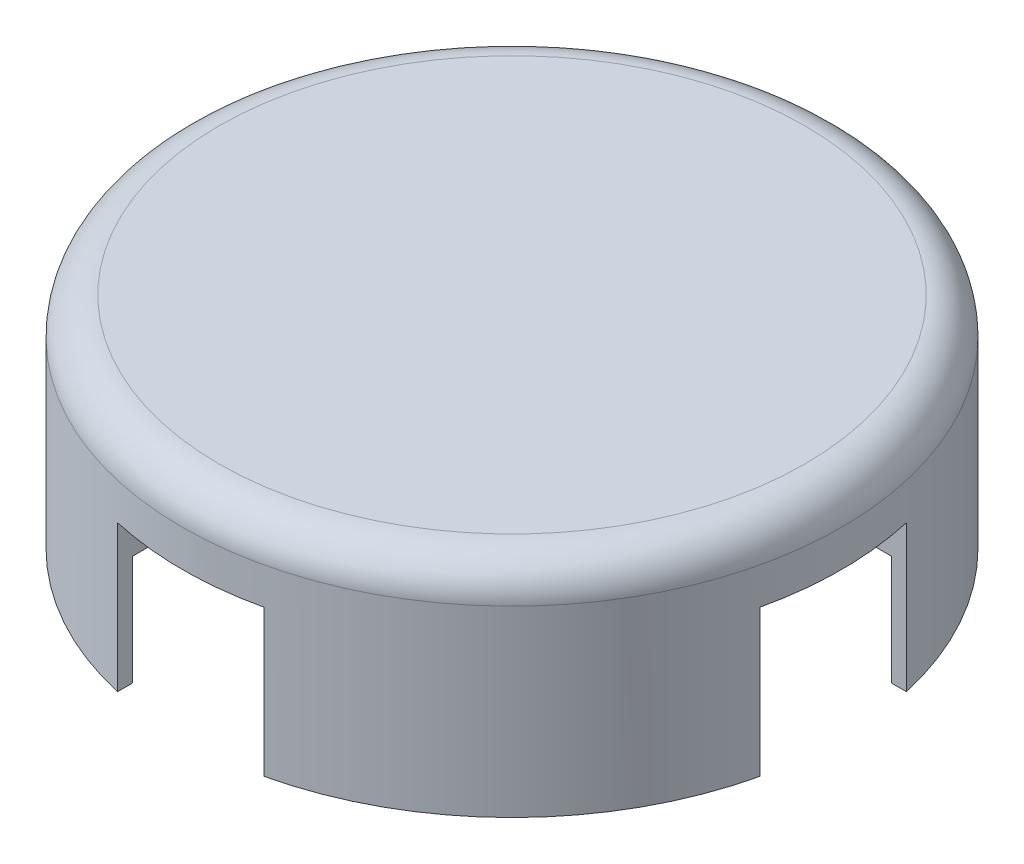
ISO-10303-21;
HEADER;
FILE_DESCRIPTION(('STEP AP214'),'2;1');
FILE_NAME('part.step','',(''),(''),'','','');
FILE_SCHEMA(('AUTOMOTIVE_DESIGN { 1 0 10303 214 1 1 1 1 }'));
ENDSEC;
DATA;
#1=APPLICATION_CONTEXT('core data for automotive mechanical design processes');
#2=APPLICATION_PROTOCOL_DEFINITION('international standard','automotive_design',2000,#1);
#3=PRODUCT_CONTEXT('',#1,'mechanical');
#4=PRODUCT('Part','Part','',(#3));
#5=PRODUCT_RELATED_PRODUCT_CATEGORY('part','',(#4));
#6=PRODUCT_DEFINITION_FORMATION('','',#4);
#7=PRODUCT_DEFINITION_CONTEXT('part definition',#1,'design');
#8=PRODUCT_DEFINITION('design','',#6,#7);
#9=PRODUCT_DEFINITION_SHAPE('','',#8);
#10=(LENGTH_UNIT() NAMED_UNIT(*) SI_UNIT(.MILLI.,.METRE.));
#11=(NAMED_UNIT(*) PLANE_ANGLE_UNIT() SI_UNIT($,.RADIAN.));
#12=(NAMED_UNIT(*) SI_UNIT($,.STERADIAN.) SOLID_ANGLE_UNIT());
#13=UNCERTAINTY_MEASURE_WITH_UNIT(LENGTH_MEASURE(1.E-05),#10,'distance_accuracy_value','');
#14=(GEOMETRIC_REPRESENTATION_CONTEXT(3) GLOBAL_UNCERTAINTY_ASSIGNED_CONTEXT((#13)) GLOBAL_UNIT_ASSIGNED_CONTEXT((#10,
#11,#12)) REPRESENTATION_CONTEXT('',''));
#15=CARTESIAN_POINT('',(0.,0.,0.));
#16=DIRECTION('',(0.,0.,1.));
#17=DIRECTION('',(1.,0.,0.));
#18=AXIS2_PLACEMENT_3D('',#15,#16,#17);
#19=CARTESIAN_POINT('',(0.,0.,0.));
#20=DIRECTION('',(0.,1.,0.));
#21=DIRECTION('',(0.,0.,1.));
#22=AXIS2_PLACEMENT_3D('',#19,#20,#21);
#23=PLANE('',#22);
#24=CARTESIAN_POINT('',(0.,0.,0.));
#25=DIRECTION('',(0.,1.,0.));
#26=DIRECTION('',(0.,0.,1.));
#27=AXIS2_PLACEMENT_3D('',#24,#25,#26);
#28=CIRCLE('',#27,45.);
#29=CARTESIAN_POINT('',(-43.8748219369606,0.,9.99999999999999));
#30=VERTEX_POINT('',#29);
#31=CARTESIAN_POINT('',(-10.,0.,43.8748219369606));
#32=VERTEX_POINT('',#31);
#33=EDGE_CURVE('E351',#30,#32,#28,.T.);
#34=ORIENTED_EDGE('',*,*,#33,.F.);
#35=DIRECTION('',(-1.,0.,0.));
#36=VECTOR('',#35,1.);
#37=CARTESIAN_POINT('',(-47.5,0.,9.99999999999999));
#38=LINE('',#37,#36);
#39=CARTESIAN_POINT('',(-41.821047332653,0.,9.99999999999999));
#40=VERTEX_POINT('',#39);
#41=EDGE_CURVE('E259',#40,#30,#38,.T.);
#42=ORIENTED_EDGE('',*,*,#41,.F.);
#43=CARTESIAN_POINT('',(0.,0.,0.));
#44=DIRECTION('',(0.,-1.,0.));
#45=DIRECTION('',(0.,0.,-1.));
#46=AXIS2_PLACEMENT_3D('',#43,#44,#45);
#47=CIRCLE('',#46,43.);
#48=CARTESIAN_POINT('',(-10.,0.,41.821047332653));
#49=VERTEX_POINT('',#48);
#50=EDGE_CURVE('E421',#49,#40,#47,.T.);
#51=ORIENTED_EDGE('',*,*,#50,.F.);
#52=DIRECTION('',(0.,0.,-1.));
#53=VECTOR('',#52,1.);
#54=CARTESIAN_POINT('',(-10.,0.,10.));
#55=LINE('',#54,#53);
#56=EDGE_CURVE('E289',#32,#49,#55,.T.);
#57=ORIENTED_EDGE('',*,*,#56,.F.);
#58=EDGE_LOOP('',(#34,#42,#51,#57));
#59=FACE_BOUND('',#58,.T.);
#60=ADVANCED_FACE('F38',(#59),#23,.F.);
#61=CARTESIAN_POINT('',(10.,0.,43.8748219369606));
#62=VERTEX_POINT('',#61);
#63=CARTESIAN_POINT('',(43.8748219369606,0.,10.));
#64=VERTEX_POINT('',#63);
#65=EDGE_CURVE('E358',#62,#64,#28,.T.);
#66=ORIENTED_EDGE('',*,*,#65,.F.);
#67=DIRECTION('',(0.,0.,1.));
#68=VECTOR('',#67,1.);
#69=CARTESIAN_POINT('',(10.,0.,47.5));
#70=LINE('',#69,#68);
#71=CARTESIAN_POINT('',(10.,0.,41.821047332653));
#72=VERTEX_POINT('',#71);
#73=EDGE_CURVE('E287',#72,#62,#70,.T.);
#74=ORIENTED_EDGE('',*,*,#73,.F.);
#75=CARTESIAN_POINT('',(41.821047332653,0.,10.));
#76=VERTEX_POINT('',#75);
#77=EDGE_CURVE('E357',#76,#72,#47,.T.);
#78=ORIENTED_EDGE('',*,*,#77,.F.);
#79=DIRECTION('',(-1.,0.,0.));
#80=VECTOR('',#79,1.);
#81=CARTESIAN_POINT('',(10.,0.,10.));
#82=LINE('',#81,#80);
#83=EDGE_CURVE('E285',#64,#76,#82,.T.);
#84=ORIENTED_EDGE('',*,*,#83,.F.);
#85=EDGE_LOOP('',(#66,#74,#78,#84));
#86=FACE_BOUND('',#85,.T.);
#87=ADVANCED_FACE('F453',(#86),#23,.F.);
#88=CARTESIAN_POINT('',(43.8748219369606,0.,-10.));
#89=VERTEX_POINT('',#88);
#90=CARTESIAN_POINT('',(10.,0.,-43.8748219369606));
#91=VERTEX_POINT('',#90);
#92=EDGE_CURVE('E362',#89,#91,#28,.T.);
#93=ORIENTED_EDGE('',*,*,#92,.F.);
#94=DIRECTION('',(1.,0.,0.));
#95=VECTOR('',#94,1.);
#96=CARTESIAN_POINT('',(47.5,0.,-10.));
#97=LINE('',#96,#95);
#98=CARTESIAN_POINT('',(41.821047332653,0.,-10.));
#99=VERTEX_POINT('',#98);
#100=EDGE_CURVE('E283',#99,#89,#97,.T.);
#101=ORIENTED_EDGE('',*,*,#100,.F.);
#102=CARTESIAN_POINT('',(10.,0.,-41.821047332653));
#103=VERTEX_POINT('',#102);
#104=EDGE_CURVE('E354',#103,#99,#47,.T.);
#105=ORIENTED_EDGE('',*,*,#104,.F.);
#106=DIRECTION('',(0.,0.,1.));
#107=VECTOR('',#106,1.);
#108=CARTESIAN_POINT('',(10.,0.,-10.));
#109=LINE('',#108,#107);
#110=EDGE_CURVE('E281',#91,#103,#109,.T.);
#111=ORIENTED_EDGE('',*,*,#110,.F.);
#112=EDGE_LOOP('',(#93,#101,#105,#111));
#113=FACE_BOUND('',#112,.T.);
#114=ADVANCED_FACE('F473',(#113),#23,.F.);
#115=CARTESIAN_POINT('',(0.,15.,0.));
#116=DIRECTION('',(0.,-1.,0.));
#117=DIRECTION('',(0.,0.,-1.));
#118=AXIS2_PLACEMENT_3D('',#115,#116,#117);
#119=CYLINDRICAL_SURFACE('',#118,43.);
#120=ORIENTED_EDGE('',*,*,#50,.T.);
#121=DIRECTION('',(0.,-1.,0.));
#122=VECTOR('',#121,1.);
#123=CARTESIAN_POINT('',(-41.821047332653,15.,9.99999999999999));
#124=LINE('',#123,#122);
#125=CARTESIAN_POINT('',(-41.821047332653,15.,9.99999999999999));
#126=VERTEX_POINT('',#125);
#127=EDGE_CURVE('E342',#40,#126,#124,.F.);
#128=ORIENTED_EDGE('',*,*,#127,.T.);
#129=CARTESIAN_POINT('',(0.,15.,0.));
#130=DIRECTION('',(0.,-1.,0.));
#131=DIRECTION('',(0.,0.,-1.));
#132=AXIS2_PLACEMENT_3D('',#129,#130,#131);
#133=CIRCLE('',#132,43.);
#134=CARTESIAN_POINT('',(-10.,15.,41.821047332653));
#135=VERTEX_POINT('',#134);
#136=EDGE_CURVE('E430',#135,#126,#133,.T.);
#137=ORIENTED_EDGE('',*,*,#136,.F.);
#138=DIRECTION('',(0.,-1.,0.));
#139=VECTOR('',#138,1.);
#140=CARTESIAN_POINT('',(-10.,15.,41.821047332653));
#141=LINE('',#140,#139);
#142=EDGE_CURVE('E336',#135,#49,#141,.T.);
#143=ORIENTED_EDGE('',*,*,#142,.T.);
#144=EDGE_LOOP('',(#120,#128,#137,#143));
#145=FACE_BOUND('',#144,.T.);
#146=ADVANCED_FACE('F428',(#145),#119,.F.);
#147=ORIENTED_EDGE('',*,*,#77,.T.);
#148=DIRECTION('',(0.,-1.,0.));
#149=VECTOR('',#148,1.);
#150=CARTESIAN_POINT('',(10.,15.,41.821047332653));
#151=LINE('',#150,#149);
#152=CARTESIAN_POINT('',(10.,15.,41.821047332653));
#153=VERTEX_POINT('',#152);
#154=EDGE_CURVE('E330',#72,#153,#151,.F.);
#155=ORIENTED_EDGE('',*,*,#154,.T.);
#156=CARTESIAN_POINT('',(41.821047332653,15.,10.));
#157=VERTEX_POINT('',#156);
#158=EDGE_CURVE('E352',#157,#153,#133,.T.);
#159=ORIENTED_EDGE('',*,*,#158,.F.);
#160=DIRECTION('',(0.,-1.,0.));
#161=VECTOR('',#160,1.);
#162=CARTESIAN_POINT('',(41.821047332653,15.,10.));
#163=LINE('',#162,#161);
#164=EDGE_CURVE('E324',#157,#76,#163,.T.);
#165=ORIENTED_EDGE('',*,*,#164,.T.);
#166=EDGE_LOOP('',(#147,#155,#159,#165));
#167=FACE_BOUND('',#166,.T.);
#168=ADVANCED_FACE('F447',(#167),#119,.F.);
#169=ORIENTED_EDGE('',*,*,#104,.T.);
#170=DIRECTION('',(0.,-1.,0.));
#171=VECTOR('',#170,1.);
#172=CARTESIAN_POINT('',(41.821047332653,15.,-10.));
#173=LINE('',#172,#171);
#174=CARTESIAN_POINT('',(41.821047332653,15.,-10.));
#175=VERTEX_POINT('',#174);
#176=EDGE_CURVE('E318',#99,#175,#173,.F.);
#177=ORIENTED_EDGE('',*,*,#176,.T.);
#178=CARTESIAN_POINT('',(10.,15.,-41.821047332653));
#179=VERTEX_POINT('',#178);
#180=EDGE_CURVE('E348',#179,#175,#133,.T.);
#181=ORIENTED_EDGE('',*,*,#180,.F.);
#182=DIRECTION('',(0.,-1.,0.));
#183=VECTOR('',#182,1.);
#184=CARTESIAN_POINT('',(10.,15.,-41.821047332653));
#185=LINE('',#184,#183);
#186=EDGE_CURVE('E312',#179,#103,#185,.T.);
#187=ORIENTED_EDGE('',*,*,#186,.T.);
#188=EDGE_LOOP('',(#169,#177,#181,#187));
#189=FACE_BOUND('',#188,.T.);
#190=ADVANCED_FACE('F482',(#189),#119,.F.);
#191=CARTESIAN_POINT('',(0.,15.,0.));
#192=DIRECTION('',(0.,-1.,0.));
#193=DIRECTION('',(0.,0.,-1.));
#194=AXIS2_PLACEMENT_3D('',#191,#192,#193);
#195=PLANE('',#194);
#196=CARTESIAN_POINT('',(-21.2132034355965,15.,21.2132034355964));
#197=DIRECTION('',(0.,-1.,0.));
#198=DIRECTION('',(0.,0.,-1.));
#199=AXIS2_PLACEMENT_3D('',#196,#197,#198);
#200=CIRCLE('',#199,2.49999999999999);
#201=CARTESIAN_POINT('',(-21.2132034355965,15.,18.7132034355964));
#202=VERTEX_POINT('',#201);
#203=EDGE_CURVE('E231',#202,#202,#200,.T.);
#204=ORIENTED_EDGE('',*,*,#203,.F.);
#205=EDGE_LOOP('',(#204));
#206=FACE_BOUND('',#205,.T.);
#207=DIRECTION('',(-1.,0.,0.));
#208=VECTOR('',#207,1.);
#209=CARTESIAN_POINT('',(0.,15.,10.));
#210=LINE('',#209,#208);
#211=CARTESIAN_POINT('',(-10.,15.,10.));
#212=VERTEX_POINT('',#211);
#213=EDGE_CURVE('E61',#212,#126,#210,.T.);
#214=ORIENTED_EDGE('',*,*,#213,.F.);
#215=DIRECTION('',(0.,0.,-1.));
#216=VECTOR('',#215,1.);
#217=CARTESIAN_POINT('',(-10.,15.,0.));
#218=LINE('',#217,#216);
#219=EDGE_CURVE('E374',#135,#212,#218,.T.);
#220=ORIENTED_EDGE('',*,*,#219,.F.);
#221=ORIENTED_EDGE('',*,*,#136,.T.);
#222=EDGE_LOOP('',(#214,#220,#221));
#223=FACE_BOUND('',#222,.T.);
#224=ADVANCED_FACE('F494',(#206,#223),#195,.T.);
#225=CARTESIAN_POINT('',(21.2132034355965,15.,21.2132034355964));
#226=DIRECTION('',(0.,-1.,0.));
#227=DIRECTION('',(0.,0.,-1.));
#228=AXIS2_PLACEMENT_3D('',#225,#226,#227);
#229=CIRCLE('',#228,2.49999999999999);
#230=CARTESIAN_POINT('',(21.2132034355965,15.,18.7132034355964));
#231=VERTEX_POINT('',#230);
#232=EDGE_CURVE('E243',#231,#231,#229,.T.);
#233=ORIENTED_EDGE('',*,*,#232,.F.);
#234=EDGE_LOOP('',(#233));
#235=FACE_BOUND('',#234,.T.);
#236=DIRECTION('',(0.,0.,1.));
#237=VECTOR('',#236,1.);
#238=CARTESIAN_POINT('',(10.,15.,0.));
#239=LINE('',#238,#237);
#240=CARTESIAN_POINT('',(10.,15.,10.));
#241=VERTEX_POINT('',#240);
#242=EDGE_CURVE('E372',#241,#153,#239,.T.);
#243=ORIENTED_EDGE('',*,*,#242,.F.);
#244=DIRECTION('',(-1.,0.,0.));
#245=VECTOR('',#244,1.);
#246=CARTESIAN_POINT('',(0.,15.,10.));
#247=LINE('',#246,#245);
#248=EDGE_CURVE('E370',#157,#241,#247,.T.);
#249=ORIENTED_EDGE('',*,*,#248,.F.);
#250=ORIENTED_EDGE('',*,*,#158,.T.);
#251=EDGE_LOOP('',(#243,#249,#250));
#252=FACE_BOUND('',#251,.T.);
#253=ADVANCED_FACE('F720',(#235,#252),#195,.T.);
#254=CARTESIAN_POINT('',(21.2132034355965,15.,-21.2132034355964));
#255=DIRECTION('',(0.,-1.,0.));
#256=DIRECTION('',(0.,0.,-1.));
#257=AXIS2_PLACEMENT_3D('',#254,#255,#256);
#258=CIRCLE('',#257,2.49999999999999);
#259=CARTESIAN_POINT('',(21.2132034355965,15.,-23.7132034355964));
#260=VERTEX_POINT('',#259);
#261=EDGE_CURVE('E237',#260,#260,#258,.T.);
#262=ORIENTED_EDGE('',*,*,#261,.F.);
#263=EDGE_LOOP('',(#262));
#264=FACE_BOUND('',#263,.T.);
#265=DIRECTION('',(1.,0.,0.));
#266=VECTOR('',#265,1.);
#267=CARTESIAN_POINT('',(0.,15.,-10.));
#268=LINE('',#267,#266);
#269=CARTESIAN_POINT('',(10.,15.,-10.));
#270=VERTEX_POINT('',#269);
#271=EDGE_CURVE('E368',#270,#175,#268,.T.);
#272=ORIENTED_EDGE('',*,*,#271,.F.);
#273=DIRECTION('',(0.,0.,1.));
#274=VECTOR('',#273,1.);
#275=CARTESIAN_POINT('',(10.,15.,0.));
#276=LINE('',#275,#274);
#277=EDGE_CURVE('E366',#179,#270,#276,.T.);
#278=ORIENTED_EDGE('',*,*,#277,.F.);
#279=ORIENTED_EDGE('',*,*,#180,.T.);
#280=EDGE_LOOP('',(#272,#278,#279));
#281=FACE_BOUND('',#280,.T.);
#282=ADVANCED_FACE('F495',(#264,#281),#195,.T.);
#283=CARTESIAN_POINT('',(0.,30.,0.));
#284=DIRECTION('',(0.,-1.,0.));
#285=DIRECTION('',(0.,0.,-1.));
#286=AXIS2_PLACEMENT_3D('',#283,#284,#285);
#287=CYLINDRICAL_SURFACE('',#286,45.);
#288=CARTESIAN_POINT('',(0.,25.,0.));
#289=DIRECTION('',(0.,1.,0.));
#290=DIRECTION('',(0.,0.,1.));
#291=AXIS2_PLACEMENT_3D('',#288,#289,#290);
#292=CIRCLE('',#291,45.);
#293=CARTESIAN_POINT('',(0.,25.,45.));
#294=VERTEX_POINT('',#293);
#295=EDGE_CURVE('E11',#294,#294,#292,.F.);
#296=ORIENTED_EDGE('',*,*,#295,.T.);
#297=EDGE_LOOP('',(#296));
#298=FACE_BOUND('',#297,.T.);
#299=ORIENTED_EDGE('',*,*,#65,.T.);
#300=DIRECTION('',(0.,-1.,0.));
#301=VECTOR('',#300,1.);
#302=CARTESIAN_POINT('',(43.8748219369606,30.,10.));
#303=LINE('',#302,#301);
#304=CARTESIAN_POINT('',(43.8748219369606,20.,10.));
#305=VERTEX_POINT('',#304);
#306=EDGE_CURVE('E327',#64,#305,#303,.F.);
#307=ORIENTED_EDGE('',*,*,#306,.T.);
#308=CARTESIAN_POINT('',(0.,20.,0.));
#309=DIRECTION('',(0.,1.,0.));
#310=DIRECTION('',(0.,0.,1.));
#311=AXIS2_PLACEMENT_3D('',#308,#309,#310);
#312=CIRCLE('',#311,45.);
#313=CARTESIAN_POINT('',(43.8748219369606,20.,-10.));
#314=VERTEX_POINT('',#313);
#315=EDGE_CURVE('E380',#305,#314,#312,.T.);
#316=ORIENTED_EDGE('',*,*,#315,.T.);
#317=DIRECTION('',(0.,-1.,0.));
#318=VECTOR('',#317,1.);
#319=CARTESIAN_POINT('',(43.8748219369606,30.,-10.));
#320=LINE('',#319,#318);
#321=EDGE_CURVE('E321',#314,#89,#320,.T.);
#322=ORIENTED_EDGE('',*,*,#321,.T.);
#323=ORIENTED_EDGE('',*,*,#92,.T.);
#324=DIRECTION('',(0.,-1.,0.));
#325=VECTOR('',#324,1.);
#326=CARTESIAN_POINT('',(10.,30.,-43.8748219369606));
#327=LINE('',#326,#325);
#328=CARTESIAN_POINT('',(10.,20.,-43.8748219369606));
#329=VERTEX_POINT('',#328);
#330=EDGE_CURVE('E315',#91,#329,#327,.F.);
#331=ORIENTED_EDGE('',*,*,#330,.T.);
#332=CARTESIAN_POINT('',(-10.,20.,-43.8748219369606));
#333=VERTEX_POINT('',#332);
#334=EDGE_CURVE('E385',#329,#333,#312,.T.);
#335=ORIENTED_EDGE('',*,*,#334,.T.);
#336=DIRECTION('',(0.,-1.,0.));
#337=VECTOR('',#336,1.);
#338=CARTESIAN_POINT('',(-10.,30.,-43.8748219369606));
#339=LINE('',#338,#337);
#340=CARTESIAN_POINT('',(-10.,0.,-43.8748219369606));
#341=VERTEX_POINT('',#340);
#342=EDGE_CURVE('E309',#333,#341,#339,.T.);
#343=ORIENTED_EDGE('',*,*,#342,.T.);
#344=CARTESIAN_POINT('',(-43.8748219369606,0.,-10.));
#345=VERTEX_POINT('',#344);
#346=EDGE_CURVE('E414',#341,#345,#28,.T.);
#347=ORIENTED_EDGE('',*,*,#346,.T.);
#348=DIRECTION('',(0.,-1.,0.));
#349=VECTOR('',#348,1.);
#350=CARTESIAN_POINT('',(-43.8748219369606,30.,-10.));
#351=LINE('',#350,#349);
#352=CARTESIAN_POINT('',(-43.8748219369606,20.,-10.));
#353=VERTEX_POINT('',#352);
#354=EDGE_CURVE('E303',#345,#353,#351,.F.);
#355=ORIENTED_EDGE('',*,*,#354,.T.);
#356=CARTESIAN_POINT('',(-43.8748219369606,20.,9.99999999999999));
#357=VERTEX_POINT('',#356);
#358=EDGE_CURVE('E379',#353,#357,#312,.T.);
#359=ORIENTED_EDGE('',*,*,#358,.T.);
#360=DIRECTION('',(0.,-1.,0.));
#361=VECTOR('',#360,1.);
#362=CARTESIAN_POINT('',(-43.8748219369606,30.,9.99999999999999));
#363=LINE('',#362,#361);
#364=EDGE_CURVE('E344',#357,#30,#363,.T.);
#365=ORIENTED_EDGE('',*,*,#364,.T.);
#366=ORIENTED_EDGE('',*,*,#33,.T.);
#367=DIRECTION('',(0.,-1.,0.));
#368=VECTOR('',#367,1.);
#369=CARTESIAN_POINT('',(-10.,30.,43.8748219369606));
#370=LINE('',#369,#368);
#371=CARTESIAN_POINT('',(-10.,20.,43.8748219369606));
#372=VERTEX_POINT('',#371);
#373=EDGE_CURVE('E339',#32,#372,#370,.F.);
#374=ORIENTED_EDGE('',*,*,#373,.T.);
#375=CARTESIAN_POINT('',(10.,20.,43.8748219369606));
#376=VERTEX_POINT('',#375);
#377=EDGE_CURVE('E377',#372,#376,#312,.T.);
#378=ORIENTED_EDGE('',*,*,#377,.T.);
#379=DIRECTION('',(0.,-1.,0.));
#380=VECTOR('',#379,1.);
#381=CARTESIAN_POINT('',(10.,30.,43.8748219369606));
#382=LINE('',#381,#380);
#383=EDGE_CURVE('E333',#376,#62,#382,.T.);
#384=ORIENTED_EDGE('',*,*,#383,.T.);
#385=EDGE_LOOP('',(#299,#307,#316,#322,#323,#331,#335,#343,#347,#355,#359,#365,#366,#374,#378,#384));
#386=FACE_BOUND('',#385,.T.);
#387=ADVANCED_FACE('F389',(#298,#386),#287,.T.);
#388=CARTESIAN_POINT('',(0.,30.,0.));
#389=DIRECTION('',(0.,1.,0.));
#390=DIRECTION('',(0.,0.,1.));
#391=AXIS2_PLACEMENT_3D('',#388,#389,#390);
#392=PLANE('',#391);
#393=CARTESIAN_POINT('',(0.,30.,0.));
#394=DIRECTION('',(0.,1.,0.));
#395=DIRECTION('',(0.,0.,1.));
#396=AXIS2_PLACEMENT_3D('',#393,#394,#395);
#397=CIRCLE('',#396,40.);
#398=CARTESIAN_POINT('',(0.,30.,40.));
#399=VERTEX_POINT('',#398);
#400=EDGE_CURVE('E46',#399,#399,#397,.T.);
#401=ORIENTED_EDGE('',*,*,#400,.T.);
#402=EDGE_LOOP('',(#401));
#403=FACE_BOUND('',#402,.T.);
#404=ADVANCED_FACE('F476',(#403),#392,.T.);
#405=ORIENTED_EDGE('',*,*,#346,.F.);
#406=DIRECTION('',(0.,0.,-1.));
#407=VECTOR('',#406,1.);
#408=CARTESIAN_POINT('',(-10.,0.,-47.5));
#409=LINE('',#408,#407);
#410=CARTESIAN_POINT('',(-10.,0.,-41.821047332653));
#411=VERTEX_POINT('',#410);
#412=EDGE_CURVE('E279',#411,#341,#409,.T.);
#413=ORIENTED_EDGE('',*,*,#412,.F.);
#414=CARTESIAN_POINT('',(-41.821047332653,0.,-10.));
#415=VERTEX_POINT('',#414);
#416=EDGE_CURVE('E347',#415,#411,#47,.T.);
#417=ORIENTED_EDGE('',*,*,#416,.F.);
#418=DIRECTION('',(1.,0.,0.));
#419=VECTOR('',#418,1.);
#420=CARTESIAN_POINT('',(-10.,0.,-10.));
#421=LINE('',#420,#419);
#422=EDGE_CURVE('E255',#345,#415,#421,.T.);
#423=ORIENTED_EDGE('',*,*,#422,.F.);
#424=EDGE_LOOP('',(#405,#413,#417,#423));
#425=FACE_BOUND('',#424,.T.);
#426=ADVANCED_FACE('F443',(#425),#23,.F.);
#427=ORIENTED_EDGE('',*,*,#416,.T.);
#428=DIRECTION('',(0.,-1.,0.));
#429=VECTOR('',#428,1.);
#430=CARTESIAN_POINT('',(-10.,15.,-41.821047332653));
#431=LINE('',#430,#429);
#432=CARTESIAN_POINT('',(-10.,15.,-41.821047332653));
#433=VERTEX_POINT('',#432);
#434=EDGE_CURVE('E306',#411,#433,#431,.F.);
#435=ORIENTED_EDGE('',*,*,#434,.T.);
#436=CARTESIAN_POINT('',(-41.821047332653,15.,-10.));
#437=VERTEX_POINT('',#436);
#438=EDGE_CURVE('E353',#437,#433,#133,.T.);
#439=ORIENTED_EDGE('',*,*,#438,.F.);
#440=DIRECTION('',(0.,-1.,0.));
#441=VECTOR('',#440,1.);
#442=CARTESIAN_POINT('',(-41.821047332653,15.,-10.));
#443=LINE('',#442,#441);
#444=EDGE_CURVE('E53',#437,#415,#443,.T.);
#445=ORIENTED_EDGE('',*,*,#444,.T.);
#446=EDGE_LOOP('',(#427,#435,#439,#445));
#447=FACE_BOUND('',#446,.T.);
#448=ADVANCED_FACE('F439',(#447),#119,.F.);
#449=CARTESIAN_POINT('',(-21.2132034355965,15.,-21.2132034355964));
#450=DIRECTION('',(0.,-1.,0.));
#451=DIRECTION('',(0.,0.,-1.));
#452=AXIS2_PLACEMENT_3D('',#449,#450,#451);
#453=CIRCLE('',#452,2.49999999999999);
#454=CARTESIAN_POINT('',(-21.2132034355965,15.,-23.7132034355964));
#455=VERTEX_POINT('',#454);
#456=EDGE_CURVE('E249',#455,#455,#453,.T.);
#457=ORIENTED_EDGE('',*,*,#456,.F.);
#458=EDGE_LOOP('',(#457));
#459=FACE_BOUND('',#458,.T.);
#460=DIRECTION('',(0.,0.,-1.));
#461=VECTOR('',#460,1.);
#462=CARTESIAN_POINT('',(-10.,15.,0.));
#463=LINE('',#462,#461);
#464=CARTESIAN_POINT('',(-10.,15.,-10.));
#465=VERTEX_POINT('',#464);
#466=EDGE_CURVE('E364',#465,#433,#463,.T.);
#467=ORIENTED_EDGE('',*,*,#466,.F.);
#468=DIRECTION('',(1.,0.,0.));
#469=VECTOR('',#468,1.);
#470=CARTESIAN_POINT('',(0.,15.,-10.));
#471=LINE('',#470,#469);
#472=EDGE_CURVE('E361',#437,#465,#471,.T.);
#473=ORIENTED_EDGE('',*,*,#472,.F.);
#474=ORIENTED_EDGE('',*,*,#438,.T.);
#475=EDGE_LOOP('',(#467,#473,#474));
#476=FACE_BOUND('',#475,.T.);
#477=ADVANCED_FACE('F436',(#459,#476),#195,.T.);
#478=CARTESIAN_POINT('',(0.,20.,0.));
#479=DIRECTION('',(0.,1.,0.));
#480=DIRECTION('',(0.,0.,1.));
#481=AXIS2_PLACEMENT_3D('',#478,#479,#480);
#482=PLANE('',#481);
#483=CARTESIAN_POINT('',(0.,20.,30.));
#484=DIRECTION('',(0.,-1.,0.));
#485=DIRECTION('',(0.,0.,-1.));
#486=AXIS2_PLACEMENT_3D('',#483,#484,#485);
#487=CIRCLE('',#486,1.65);
#488=CARTESIAN_POINT('',(0.,20.,28.35));
#489=VERTEX_POINT('',#488);
#490=EDGE_CURVE('E209',#489,#489,#487,.T.);
#491=ORIENTED_EDGE('',*,*,#490,.F.);
#492=EDGE_LOOP('',(#491));
#493=FACE_BOUND('',#492,.T.);
#494=CARTESIAN_POINT('',(0.,20.,-30.));
#495=DIRECTION('',(0.,-1.,0.));
#496=DIRECTION('',(0.,0.,-1.));
#497=AXIS2_PLACEMENT_3D('',#494,#495,#496);
#498=CIRCLE('',#497,1.65);
#499=CARTESIAN_POINT('',(0.,20.,-31.65));
#500=VERTEX_POINT('',#499);
#501=EDGE_CURVE('E208',#500,#500,#498,.T.);
#502=ORIENTED_EDGE('',*,*,#501,.F.);
#503=EDGE_LOOP('',(#502));
#504=FACE_BOUND('',#503,.T.);
#505=CARTESIAN_POINT('',(-30.,20.,0.));
#506=DIRECTION('',(0.,-1.,0.));
#507=DIRECTION('',(0.,0.,-1.));
#508=AXIS2_PLACEMENT_3D('',#505,#506,#507);
#509=CIRCLE('',#508,1.65);
#510=CARTESIAN_POINT('',(-30.,20.,-1.65));
#511=VERTEX_POINT('',#510);
#512=EDGE_CURVE('E219',#511,#511,#509,.T.);
#513=ORIENTED_EDGE('',*,*,#512,.F.);
#514=EDGE_LOOP('',(#513));
#515=FACE_BOUND('',#514,.T.);
#516=CARTESIAN_POINT('',(30.,20.,0.));
#517=DIRECTION('',(0.,-1.,0.));
#518=DIRECTION('',(0.,0.,-1.));
#519=AXIS2_PLACEMENT_3D('',#516,#517,#518);
#520=CIRCLE('',#519,1.65);
#521=CARTESIAN_POINT('',(30.,20.,-1.65));
#522=VERTEX_POINT('',#521);
#523=EDGE_CURVE('E225',#522,#522,#520,.T.);
#524=ORIENTED_EDGE('',*,*,#523,.F.);
#525=EDGE_LOOP('',(#524));
#526=FACE_BOUND('',#525,.T.);
#527=DIRECTION('',(-1.,0.,0.));
#528=VECTOR('',#527,1.);
#529=CARTESIAN_POINT('',(10.,20.,10.));
#530=LINE('',#529,#528);
#531=CARTESIAN_POINT('',(10.,20.,10.));
#532=VERTEX_POINT('',#531);
#533=EDGE_CURVE('E267',#305,#532,#530,.T.);
#534=ORIENTED_EDGE('',*,*,#533,.T.);
#535=DIRECTION('',(0.,0.,1.));
#536=VECTOR('',#535,1.);
#537=CARTESIAN_POINT('',(10.,20.,47.5));
#538=LINE('',#537,#536);
#539=EDGE_CURVE('E269',#532,#376,#538,.T.);
#540=ORIENTED_EDGE('',*,*,#539,.T.);
#541=ORIENTED_EDGE('',*,*,#377,.F.);
#542=DIRECTION('',(0.,0.,-1.));
#543=VECTOR('',#542,1.);
#544=CARTESIAN_POINT('',(-10.,20.,10.));
#545=LINE('',#544,#543);
#546=CARTESIAN_POINT('',(-10.,20.,10.));
#547=VERTEX_POINT('',#546);
#548=EDGE_CURVE('E272',#372,#547,#545,.T.);
#549=ORIENTED_EDGE('',*,*,#548,.T.);
#550=DIRECTION('',(-1.,0.,0.));
#551=VECTOR('',#550,1.);
#552=CARTESIAN_POINT('',(-47.5,20.,9.99999999999999));
#553=LINE('',#552,#551);
#554=EDGE_CURVE('E274',#547,#357,#553,.T.);
#555=ORIENTED_EDGE('',*,*,#554,.T.);
#556=ORIENTED_EDGE('',*,*,#358,.F.);
#557=DIRECTION('',(1.,0.,0.));
#558=VECTOR('',#557,1.);
#559=CARTESIAN_POINT('',(-10.,20.,-10.));
#560=LINE('',#559,#558);
#561=CARTESIAN_POINT('',(-10.,20.,-10.));
#562=VERTEX_POINT('',#561);
#563=EDGE_CURVE('E256',#353,#562,#560,.T.);
#564=ORIENTED_EDGE('',*,*,#563,.T.);
#565=DIRECTION('',(0.,0.,-1.));
#566=VECTOR('',#565,1.);
#567=CARTESIAN_POINT('',(-10.,20.,-47.5));
#568=LINE('',#567,#566);
#569=EDGE_CURVE('E258',#562,#333,#568,.T.);
#570=ORIENTED_EDGE('',*,*,#569,.T.);
#571=ORIENTED_EDGE('',*,*,#334,.F.);
#572=DIRECTION('',(0.,0.,1.));
#573=VECTOR('',#572,1.);
#574=CARTESIAN_POINT('',(10.,20.,-10.));
#575=LINE('',#574,#573);
#576=CARTESIAN_POINT('',(10.,20.,-10.));
#577=VERTEX_POINT('',#576);
#578=EDGE_CURVE('E262',#329,#577,#575,.T.);
#579=ORIENTED_EDGE('',*,*,#578,.T.);
#580=DIRECTION('',(1.,0.,0.));
#581=VECTOR('',#580,1.);
#582=CARTESIAN_POINT('',(47.5,20.,-10.));
#583=LINE('',#582,#581);
#584=EDGE_CURVE('E264',#577,#314,#583,.T.);
#585=ORIENTED_EDGE('',*,*,#584,.T.);
#586=ORIENTED_EDGE('',*,*,#315,.F.);
#587=EDGE_LOOP('',(#534,#540,#541,#549,#555,#556,#564,#570,#571,#579,#585,#586));
#588=FACE_BOUND('',#587,.T.);
#589=ADVANCED_FACE('F395',(#493,#504,#515,#526,#588),#482,.F.);
#590=CARTESIAN_POINT('',(-47.5,20.,9.99999999999999));
#591=DIRECTION('',(0.,0.,1.));
#592=DIRECTION('',(1.,0.,0.));
#593=AXIS2_PLACEMENT_3D('',#590,#591,#592);
#594=PLANE('',#593);
#595=ORIENTED_EDGE('',*,*,#554,.F.);
#596=DIRECTION('',(0.,-1.,0.));
#597=VECTOR('',#596,1.);
#598=CARTESIAN_POINT('',(-10.,20.,10.));
#599=LINE('',#598,#597);
#600=EDGE_CURVE('E292',#547,#212,#599,.T.);
#601=ORIENTED_EDGE('',*,*,#600,.T.);
#602=ORIENTED_EDGE('',*,*,#213,.T.);
#603=ORIENTED_EDGE('',*,*,#127,.F.);
#604=ORIENTED_EDGE('',*,*,#41,.T.);
#605=ORIENTED_EDGE('',*,*,#364,.F.);
#606=EDGE_LOOP('',(#595,#601,#602,#603,#604,#605));
#607=FACE_BOUND('',#606,.T.);
#608=ADVANCED_FACE('F458',(#607),#594,.F.);
#609=CARTESIAN_POINT('',(-10.,20.,10.));
#610=DIRECTION('',(-1.,0.,0.));
#611=DIRECTION('',(0.,0.,1.));
#612=AXIS2_PLACEMENT_3D('',#609,#610,#611);
#613=PLANE('',#612);
#614=ORIENTED_EDGE('',*,*,#56,.T.);
#615=ORIENTED_EDGE('',*,*,#142,.F.);
#616=ORIENTED_EDGE('',*,*,#219,.T.);
#617=ORIENTED_EDGE('',*,*,#600,.F.);
#618=ORIENTED_EDGE('',*,*,#548,.F.);
#619=ORIENTED_EDGE('',*,*,#373,.F.);
#620=EDGE_LOOP('',(#614,#615,#616,#617,#618,#619));
#621=FACE_BOUND('',#620,.T.);
#622=ADVANCED_FACE('F423',(#621),#613,.F.);
#623=CARTESIAN_POINT('',(10.,20.,47.5));
#624=DIRECTION('',(1.,0.,0.));
#625=DIRECTION('',(0.,0.,-1.));
#626=AXIS2_PLACEMENT_3D('',#623,#624,#625);
#627=PLANE('',#626);
#628=ORIENTED_EDGE('',*,*,#539,.F.);
#629=DIRECTION('',(0.,-1.,0.));
#630=VECTOR('',#629,1.);
#631=CARTESIAN_POINT('',(10.,20.,10.));
#632=LINE('',#631,#630);
#633=EDGE_CURVE('E294',#532,#241,#632,.T.);
#634=ORIENTED_EDGE('',*,*,#633,.T.);
#635=ORIENTED_EDGE('',*,*,#242,.T.);
#636=ORIENTED_EDGE('',*,*,#154,.F.);
#637=ORIENTED_EDGE('',*,*,#73,.T.);
#638=ORIENTED_EDGE('',*,*,#383,.F.);
#639=EDGE_LOOP('',(#628,#634,#635,#636,#637,#638));
#640=FACE_BOUND('',#639,.T.);
#641=ADVANCED_FACE('F456',(#640),#627,.F.);
#642=CARTESIAN_POINT('',(10.,20.,10.));
#643=DIRECTION('',(0.,0.,1.));
#644=DIRECTION('',(1.,0.,0.));
#645=AXIS2_PLACEMENT_3D('',#642,#643,#644);
#646=PLANE('',#645);
#647=ORIENTED_EDGE('',*,*,#83,.T.);
#648=ORIENTED_EDGE('',*,*,#164,.F.);
#649=ORIENTED_EDGE('',*,*,#248,.T.);
#650=ORIENTED_EDGE('',*,*,#633,.F.);
#651=ORIENTED_EDGE('',*,*,#533,.F.);
#652=ORIENTED_EDGE('',*,*,#306,.F.);
#653=EDGE_LOOP('',(#647,#648,#649,#650,#651,#652));
#654=FACE_BOUND('',#653,.T.);
#655=ADVANCED_FACE('F505',(#654),#646,.F.);
#656=CARTESIAN_POINT('',(47.5,20.,-10.));
#657=DIRECTION('',(0.,0.,-1.));
#658=DIRECTION('',(-1.,0.,0.));
#659=AXIS2_PLACEMENT_3D('',#656,#657,#658);
#660=PLANE('',#659);
#661=ORIENTED_EDGE('',*,*,#584,.F.);
#662=DIRECTION('',(0.,-1.,0.));
#663=VECTOR('',#662,1.);
#664=CARTESIAN_POINT('',(10.,20.,-10.));
#665=LINE('',#664,#663);
#666=EDGE_CURVE('E297',#577,#270,#665,.T.);
#667=ORIENTED_EDGE('',*,*,#666,.T.);
#668=ORIENTED_EDGE('',*,*,#271,.T.);
#669=ORIENTED_EDGE('',*,*,#176,.F.);
#670=ORIENTED_EDGE('',*,*,#100,.T.);
#671=ORIENTED_EDGE('',*,*,#321,.F.);
#672=EDGE_LOOP('',(#661,#667,#668,#669,#670,#671));
#673=FACE_BOUND('',#672,.T.);
#674=ADVANCED_FACE('F502',(#673),#660,.F.);
#675=CARTESIAN_POINT('',(10.,20.,-10.));
#676=DIRECTION('',(1.,0.,0.));
#677=DIRECTION('',(0.,0.,-1.));
#678=AXIS2_PLACEMENT_3D('',#675,#676,#677);
#679=PLANE('',#678);
#680=ORIENTED_EDGE('',*,*,#110,.T.);
#681=ORIENTED_EDGE('',*,*,#186,.F.);
#682=ORIENTED_EDGE('',*,*,#277,.T.);
#683=ORIENTED_EDGE('',*,*,#666,.F.);
#684=ORIENTED_EDGE('',*,*,#578,.F.);
#685=ORIENTED_EDGE('',*,*,#330,.F.);
#686=EDGE_LOOP('',(#680,#681,#682,#683,#684,#685));
#687=FACE_BOUND('',#686,.T.);
#688=ADVANCED_FACE('F407',(#687),#679,.F.);
#689=CARTESIAN_POINT('',(-10.,20.,-47.5));
#690=DIRECTION('',(-1.,0.,0.));
#691=DIRECTION('',(0.,0.,1.));
#692=AXIS2_PLACEMENT_3D('',#689,#690,#691);
#693=PLANE('',#692);
#694=ORIENTED_EDGE('',*,*,#569,.F.);
#695=DIRECTION('',(0.,-1.,0.));
#696=VECTOR('',#695,1.);
#697=CARTESIAN_POINT('',(-10.,20.,-10.));
#698=LINE('',#697,#696);
#699=EDGE_CURVE('E277',#562,#465,#698,.T.);
#700=ORIENTED_EDGE('',*,*,#699,.T.);
#701=ORIENTED_EDGE('',*,*,#466,.T.);
#702=ORIENTED_EDGE('',*,*,#434,.F.);
#703=ORIENTED_EDGE('',*,*,#412,.T.);
#704=ORIENTED_EDGE('',*,*,#342,.F.);
#705=EDGE_LOOP('',(#694,#700,#701,#702,#703,#704));
#706=FACE_BOUND('',#705,.T.);
#707=ADVANCED_FACE('F403',(#706),#693,.F.);
#708=CARTESIAN_POINT('',(-10.,20.,-10.));
#709=DIRECTION('',(0.,0.,-1.));
#710=DIRECTION('',(-1.,0.,0.));
#711=AXIS2_PLACEMENT_3D('',#708,#709,#710);
#712=PLANE('',#711);
#713=ORIENTED_EDGE('',*,*,#422,.T.);
#714=ORIENTED_EDGE('',*,*,#444,.F.);
#715=ORIENTED_EDGE('',*,*,#472,.T.);
#716=ORIENTED_EDGE('',*,*,#699,.F.);
#717=ORIENTED_EDGE('',*,*,#563,.F.);
#718=ORIENTED_EDGE('',*,*,#354,.F.);
#719=EDGE_LOOP('',(#713,#714,#715,#716,#717,#718));
#720=FACE_BOUND('',#719,.T.);
#721=ADVANCED_FACE('F398',(#720),#712,.F.);
#722=CARTESIAN_POINT('',(0.,25.,0.));
#723=DIRECTION('',(0.,1.,0.));
#724=DIRECTION('',(0.,0.,1.));
#725=AXIS2_PLACEMENT_3D('',#722,#723,#724);
#726=TOROIDAL_SURFACE('',#725,40.,5.);
#727=ORIENTED_EDGE('',*,*,#295,.F.);
#728=EDGE_LOOP('',(#727));
#729=FACE_BOUND('',#728,.T.);
#730=ORIENTED_EDGE('',*,*,#400,.F.);
#731=EDGE_LOOP('',(#730));
#732=FACE_BOUND('',#731,.T.);
#733=ADVANCED_FACE('F40',(#729,#732),#726,.T.);
#734=CARTESIAN_POINT('',(-21.2132034355965,28.,-21.2132034355964));
#735=DIRECTION('',(0.,-1.,0.));
#736=DIRECTION('',(0.,0.,-1.));
#737=AXIS2_PLACEMENT_3D('',#734,#735,#736);
#738=CONICAL_SURFACE('',#737,2.5,1.02974425867665);
#739=CARTESIAN_POINT('',(-21.2132034355965,29.5021515475689,-21.2132034355964));
#740=VERTEX_POINT('',#739);
#741=VERTEX_LOOP('',#740);
#742=FACE_BOUND('',#741,.T.);
#743=CARTESIAN_POINT('',(-21.2132034355965,28.,-21.2132034355964));
#744=DIRECTION('',(0.,-1.,0.));
#745=DIRECTION('',(0.,0.,-1.));
#746=AXIS2_PLACEMENT_3D('',#743,#744,#745);
#747=CIRCLE('',#746,2.5);
#748=CARTESIAN_POINT('',(-21.2132034355965,28.,-23.7132034355964));
#749=VERTEX_POINT('',#748);
#750=EDGE_CURVE('E252',#749,#749,#747,.T.);
#751=ORIENTED_EDGE('',*,*,#750,.T.);
#752=EDGE_LOOP('',(#751));
#753=FACE_BOUND('',#752,.T.);
#754=ADVANCED_FACE('F541',(#742,#753),#738,.F.);
#755=CARTESIAN_POINT('',(-21.2132034355965,15.,-21.2132034355964));
#756=DIRECTION('',(0.,-1.,0.));
#757=DIRECTION('',(0.,0.,-1.));
#758=AXIS2_PLACEMENT_3D('',#755,#756,#757);
#759=CYLINDRICAL_SURFACE('',#758,2.49999999999999);
#760=ORIENTED_EDGE('',*,*,#750,.F.);
#761=EDGE_LOOP('',(#760));
#762=FACE_BOUND('',#761,.T.);
#763=ORIENTED_EDGE('',*,*,#456,.T.);
#764=EDGE_LOOP('',(#763));
#765=FACE_BOUND('',#764,.T.);
#766=ADVANCED_FACE('F548',(#762,#765),#759,.F.);
#767=CARTESIAN_POINT('',(21.2132034355965,28.,21.2132034355964));
#768=DIRECTION('',(0.,-1.,0.));
#769=DIRECTION('',(0.,0.,-1.));
#770=AXIS2_PLACEMENT_3D('',#767,#768,#769);
#771=CONICAL_SURFACE('',#770,2.5,1.02974425867665);
#772=CARTESIAN_POINT('',(21.2132034355965,29.5021515475689,21.2132034355964));
#773=VERTEX_POINT('',#772);
#774=VERTEX_LOOP('',#773);
#775=FACE_BOUND('',#774,.T.);
#776=CARTESIAN_POINT('',(21.2132034355965,28.,21.2132034355964));
#777=DIRECTION('',(0.,-1.,0.));
#778=DIRECTION('',(0.,0.,-1.));
#779=AXIS2_PLACEMENT_3D('',#776,#777,#778);
#780=CIRCLE('',#779,2.5);
#781=CARTESIAN_POINT('',(21.2132034355965,28.,18.7132034355964));
#782=VERTEX_POINT('',#781);
#783=EDGE_CURVE('E246',#782,#782,#780,.T.);
#784=ORIENTED_EDGE('',*,*,#783,.T.);
#785=EDGE_LOOP('',(#784));
#786=FACE_BOUND('',#785,.T.);
#787=ADVANCED_FACE('F557',(#775,#786),#771,.F.);
#788=CARTESIAN_POINT('',(21.2132034355965,15.,21.2132034355964));
#789=DIRECTION('',(0.,-1.,0.));
#790=DIRECTION('',(0.,0.,-1.));
#791=AXIS2_PLACEMENT_3D('',#788,#789,#790);
#792=CYLINDRICAL_SURFACE('',#791,2.49999999999999);
#793=ORIENTED_EDGE('',*,*,#783,.F.);
#794=EDGE_LOOP('',(#793));
#795=FACE_BOUND('',#794,.T.);
#796=ORIENTED_EDGE('',*,*,#232,.T.);
#797=EDGE_LOOP('',(#796));
#798=FACE_BOUND('',#797,.T.);
#799=ADVANCED_FACE('F565',(#795,#798),#792,.F.);
#800=CARTESIAN_POINT('',(21.2132034355965,28.,-21.2132034355964));
#801=DIRECTION('',(0.,-1.,0.));
#802=DIRECTION('',(0.,0.,-1.));
#803=AXIS2_PLACEMENT_3D('',#800,#801,#802);
#804=CONICAL_SURFACE('',#803,2.5,1.02974425867665);
#805=CARTESIAN_POINT('',(21.2132034355965,29.5021515475689,-21.2132034355964));
#806=VERTEX_POINT('',#805);
#807=VERTEX_LOOP('',#806);
#808=FACE_BOUND('',#807,.T.);
#809=CARTESIAN_POINT('',(21.2132034355965,28.,-21.2132034355964));
#810=DIRECTION('',(0.,-1.,0.));
#811=DIRECTION('',(0.,0.,-1.));
#812=AXIS2_PLACEMENT_3D('',#809,#810,#811);
#813=CIRCLE('',#812,2.5);
#814=CARTESIAN_POINT('',(21.2132034355965,28.,-23.7132034355964));
#815=VERTEX_POINT('',#814);
#816=EDGE_CURVE('E240',#815,#815,#813,.T.);
#817=ORIENTED_EDGE('',*,*,#816,.T.);
#818=EDGE_LOOP('',(#817));
#819=FACE_BOUND('',#818,.T.);
#820=ADVANCED_FACE('F573',(#808,#819),#804,.F.);
#821=CARTESIAN_POINT('',(21.2132034355965,15.,-21.2132034355964));
#822=DIRECTION('',(0.,-1.,0.));
#823=DIRECTION('',(0.,0.,-1.));
#824=AXIS2_PLACEMENT_3D('',#821,#822,#823);
#825=CYLINDRICAL_SURFACE('',#824,2.49999999999999);
#826=ORIENTED_EDGE('',*,*,#816,.F.);
#827=EDGE_LOOP('',(#826));
#828=FACE_BOUND('',#827,.T.);
#829=ORIENTED_EDGE('',*,*,#261,.T.);
#830=EDGE_LOOP('',(#829));
#831=FACE_BOUND('',#830,.T.);
#832=ADVANCED_FACE('F581',(#828,#831),#825,.F.);
#833=CARTESIAN_POINT('',(-21.2132034355965,28.,21.2132034355964));
#834=DIRECTION('',(0.,-1.,0.));
#835=DIRECTION('',(0.,0.,-1.));
#836=AXIS2_PLACEMENT_3D('',#833,#834,#835);
#837=CONICAL_SURFACE('',#836,2.5,1.02974425867665);
#838=CARTESIAN_POINT('',(-21.2132034355965,29.5021515475689,21.2132034355964));
#839=VERTEX_POINT('',#838);
#840=VERTEX_LOOP('',#839);
#841=FACE_BOUND('',#840,.T.);
#842=CARTESIAN_POINT('',(-21.2132034355965,28.,21.2132034355964));
#843=DIRECTION('',(0.,-1.,0.));
#844=DIRECTION('',(0.,0.,-1.));
#845=AXIS2_PLACEMENT_3D('',#842,#843,#844);
#846=CIRCLE('',#845,2.5);
#847=CARTESIAN_POINT('',(-21.2132034355965,28.,18.7132034355964));
#848=VERTEX_POINT('',#847);
#849=EDGE_CURVE('E234',#848,#848,#846,.T.);
#850=ORIENTED_EDGE('',*,*,#849,.T.);
#851=EDGE_LOOP('',(#850));
#852=FACE_BOUND('',#851,.T.);
#853=ADVANCED_FACE('F589',(#841,#852),#837,.F.);
#854=CARTESIAN_POINT('',(-21.2132034355965,15.,21.2132034355964));
#855=DIRECTION('',(0.,-1.,0.));
#856=DIRECTION('',(0.,0.,-1.));
#857=AXIS2_PLACEMENT_3D('',#854,#855,#856);
#858=CYLINDRICAL_SURFACE('',#857,2.49999999999999);
#859=ORIENTED_EDGE('',*,*,#849,.F.);
#860=EDGE_LOOP('',(#859));
#861=FACE_BOUND('',#860,.T.);
#862=ORIENTED_EDGE('',*,*,#203,.T.);
#863=EDGE_LOOP('',(#862));
#864=FACE_BOUND('',#863,.T.);
#865=ADVANCED_FACE('F597',(#861,#864),#858,.F.);
#866=CARTESIAN_POINT('',(30.,28.,0.));
#867=DIRECTION('',(0.,-1.,0.));
#868=DIRECTION('',(0.,0.,-1.));
#869=AXIS2_PLACEMENT_3D('',#866,#867,#868);
#870=CONICAL_SURFACE('',#869,1.65,1.02974425867665);
#871=CARTESIAN_POINT('',(30.,28.9914200213955,0.));
#872=VERTEX_POINT('',#871);
#873=VERTEX_LOOP('',#872);
#874=FACE_BOUND('',#873,.T.);
#875=CARTESIAN_POINT('',(30.,28.,0.));
#876=DIRECTION('',(0.,-1.,0.));
#877=DIRECTION('',(0.,0.,-1.));
#878=AXIS2_PLACEMENT_3D('',#875,#876,#877);
#879=CIRCLE('',#878,1.65);
#880=CARTESIAN_POINT('',(30.,28.,-1.65));
#881=VERTEX_POINT('',#880);
#882=EDGE_CURVE('E228',#881,#881,#879,.T.);
#883=ORIENTED_EDGE('',*,*,#882,.T.);
#884=EDGE_LOOP('',(#883));
#885=FACE_BOUND('',#884,.T.);
#886=ADVANCED_FACE('F605',(#874,#885),#870,.F.);
#887=CARTESIAN_POINT('',(30.,20.,0.));
#888=DIRECTION('',(0.,-1.,0.));
#889=DIRECTION('',(0.,0.,-1.));
#890=AXIS2_PLACEMENT_3D('',#887,#888,#889);
#891=CYLINDRICAL_SURFACE('',#890,1.65);
#892=ORIENTED_EDGE('',*,*,#882,.F.);
#893=EDGE_LOOP('',(#892));
#894=FACE_BOUND('',#893,.T.);
#895=ORIENTED_EDGE('',*,*,#523,.T.);
#896=EDGE_LOOP('',(#895));
#897=FACE_BOUND('',#896,.T.);
#898=ADVANCED_FACE('F613',(#894,#897),#891,.F.);
#899=CARTESIAN_POINT('',(-30.,28.,0.));
#900=DIRECTION('',(0.,-1.,0.));
#901=DIRECTION('',(0.,0.,-1.));
#902=AXIS2_PLACEMENT_3D('',#899,#900,#901);
#903=CONICAL_SURFACE('',#902,1.65,1.02974425867665);
#904=CARTESIAN_POINT('',(-30.,28.9914200213955,0.));
#905=VERTEX_POINT('',#904);
#906=VERTEX_LOOP('',#905);
#907=FACE_BOUND('',#906,.T.);
#908=CARTESIAN_POINT('',(-30.,28.,0.));
#909=DIRECTION('',(0.,-1.,0.));
#910=DIRECTION('',(0.,0.,-1.));
#911=AXIS2_PLACEMENT_3D('',#908,#909,#910);
#912=CIRCLE('',#911,1.65);
#913=CARTESIAN_POINT('',(-30.,28.,-1.65));
#914=VERTEX_POINT('',#913);
#915=EDGE_CURVE('E222',#914,#914,#912,.T.);
#916=ORIENTED_EDGE('',*,*,#915,.T.);
#917=EDGE_LOOP('',(#916));
#918=FACE_BOUND('',#917,.T.);
#919=ADVANCED_FACE('F621',(#907,#918),#903,.F.);
#920=CARTESIAN_POINT('',(-30.,20.,0.));
#921=DIRECTION('',(0.,-1.,0.));
#922=DIRECTION('',(0.,0.,-1.));
#923=AXIS2_PLACEMENT_3D('',#920,#921,#922);
#924=CYLINDRICAL_SURFACE('',#923,1.65);
#925=ORIENTED_EDGE('',*,*,#915,.F.);
#926=EDGE_LOOP('',(#925));
#927=FACE_BOUND('',#926,.T.);
#928=ORIENTED_EDGE('',*,*,#512,.T.);
#929=EDGE_LOOP('',(#928));
#930=FACE_BOUND('',#929,.T.);
#931=ADVANCED_FACE('F629',(#927,#930),#924,.F.);
#932=CARTESIAN_POINT('',(0.,28.,-30.));
#933=DIRECTION('',(0.,-1.,0.));
#934=DIRECTION('',(0.,0.,-1.));
#935=AXIS2_PLACEMENT_3D('',#932,#933,#934);
#936=CONICAL_SURFACE('',#935,1.65,1.02974425867665);
#937=CARTESIAN_POINT('',(0.,28.9914200213955,-30.));
#938=VERTEX_POINT('',#937);
#939=VERTEX_LOOP('',#938);
#940=FACE_BOUND('',#939,.T.);
#941=CARTESIAN_POINT('',(0.,28.,-30.));
#942=DIRECTION('',(0.,-1.,0.));
#943=DIRECTION('',(0.,0.,-1.));
#944=AXIS2_PLACEMENT_3D('',#941,#942,#943);
#945=CIRCLE('',#944,1.65);
#946=CARTESIAN_POINT('',(0.,28.,-31.65));
#947=VERTEX_POINT('',#946);
#948=EDGE_CURVE('E212',#947,#947,#945,.T.);
#949=ORIENTED_EDGE('',*,*,#948,.T.);
#950=EDGE_LOOP('',(#949));
#951=FACE_BOUND('',#950,.T.);
#952=ADVANCED_FACE('F637',(#940,#951),#936,.F.);
#953=CARTESIAN_POINT('',(0.,20.,-30.));
#954=DIRECTION('',(0.,-1.,0.));
#955=DIRECTION('',(0.,0.,-1.));
#956=AXIS2_PLACEMENT_3D('',#953,#954,#955);
#957=CYLINDRICAL_SURFACE('',#956,1.65);
#958=ORIENTED_EDGE('',*,*,#948,.F.);
#959=EDGE_LOOP('',(#958));
#960=FACE_BOUND('',#959,.T.);
#961=ORIENTED_EDGE('',*,*,#501,.T.);
#962=EDGE_LOOP('',(#961));
#963=FACE_BOUND('',#962,.T.);
#964=ADVANCED_FACE('F202',(#960,#963),#957,.F.);
#965=CARTESIAN_POINT('',(0.,28.,30.));
#966=DIRECTION('',(0.,-1.,0.));
#967=DIRECTION('',(0.,0.,-1.));
#968=AXIS2_PLACEMENT_3D('',#965,#966,#967);
#969=CONICAL_SURFACE('',#968,1.65,1.02974425867665);
#970=CARTESIAN_POINT('',(0.,28.9914200213955,30.));
#971=VERTEX_POINT('',#970);
#972=VERTEX_LOOP('',#971);
#973=FACE_BOUND('',#972,.T.);
#974=CARTESIAN_POINT('',(0.,28.,30.));
#975=DIRECTION('',(0.,-1.,0.));
#976=DIRECTION('',(0.,0.,-1.));
#977=AXIS2_PLACEMENT_3D('',#974,#975,#976);
#978=CIRCLE('',#977,1.65);
#979=CARTESIAN_POINT('',(0.,28.,28.35));
#980=VERTEX_POINT('',#979);
#981=EDGE_CURVE('E206',#980,#980,#978,.T.);
#982=ORIENTED_EDGE('',*,*,#981,.T.);
#983=EDGE_LOOP('',(#982));
#984=FACE_BOUND('',#983,.T.);
#985=ADVANCED_FACE('F198',(#973,#984),#969,.F.);
#986=CARTESIAN_POINT('',(0.,20.,30.));
#987=DIRECTION('',(0.,-1.,0.));
#988=DIRECTION('',(0.,0.,-1.));
#989=AXIS2_PLACEMENT_3D('',#986,#987,#988);
#990=CYLINDRICAL_SURFACE('',#989,1.65);
#991=ORIENTED_EDGE('',*,*,#981,.F.);
#992=EDGE_LOOP('',(#991));
#993=FACE_BOUND('',#992,.T.);
#994=ORIENTED_EDGE('',*,*,#490,.T.);
#995=EDGE_LOOP('',(#994));
#996=FACE_BOUND('',#995,.T.);
#997=ADVANCED_FACE('F201',(#993,#996),#990,.F.);
#998=CLOSED_SHELL('',(#60,#87,#114,#146,#168,#190,#224,#253,#282,#387,#404,#426,#448,#477,#589,
#608,#622,#641,#655,#674,#688,#707,#721,#733,#754,#766,#787,#799,#820,#832,#853,#865,#886,#898,
#919,#931,#952,#964,#985,#997));
#999=MANIFOLD_SOLID_BREP('B2',#998);
#1000=ADVANCED_BREP_SHAPE_REPRESENTATION('',(#18,#999),#14);
#1001=SHAPE_DEFINITION_REPRESENTATION(#9,#1000);
ENDSEC;
END-ISO-10303-21;
